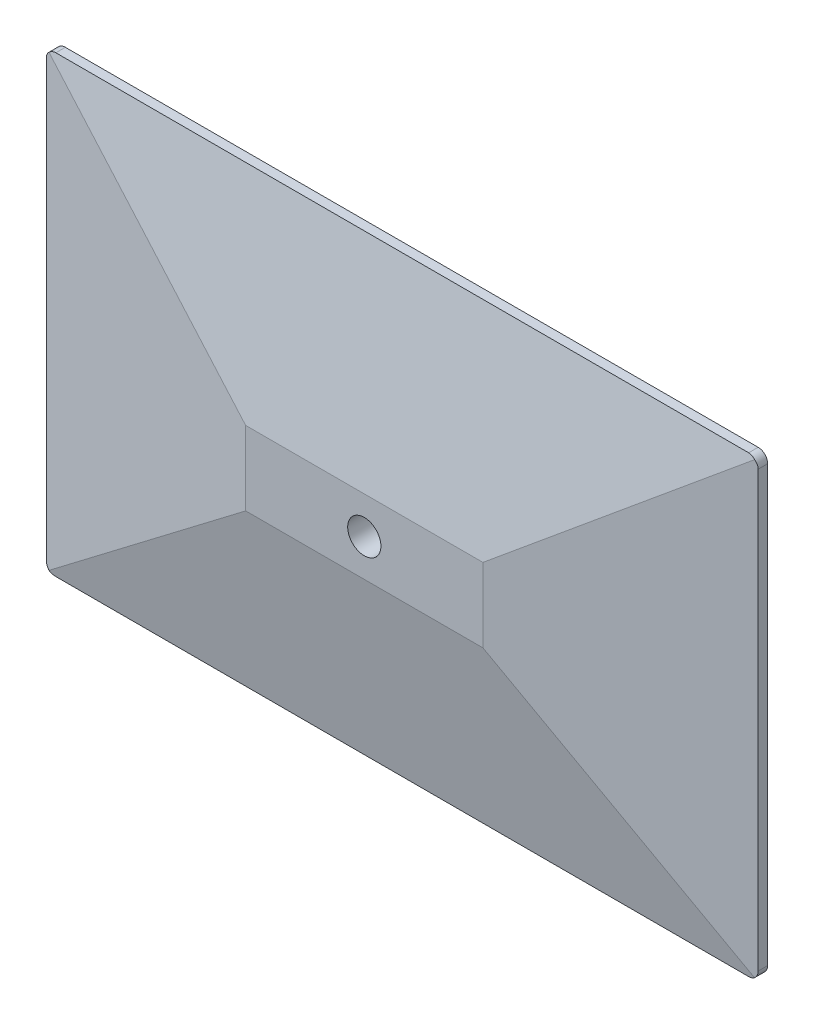
ISO-10303-21;
HEADER;
FILE_DESCRIPTION(('STEP AP214'),'2;1');
FILE_NAME('part.step','',(''),(''),'','','');
FILE_SCHEMA(('AUTOMOTIVE_DESIGN { 1 0 10303 214 1 1 1 1 }'));
ENDSEC;
DATA;
#1=APPLICATION_CONTEXT('core data for automotive mechanical design processes');
#2=APPLICATION_PROTOCOL_DEFINITION('international standard','automotive_design',2000,#1);
#3=PRODUCT_CONTEXT('',#1,'mechanical');
#4=PRODUCT('Part','Part','',(#3));
#5=PRODUCT_RELATED_PRODUCT_CATEGORY('part','',(#4));
#6=PRODUCT_DEFINITION_FORMATION('','',#4);
#7=PRODUCT_DEFINITION_CONTEXT('part definition',#1,'design');
#8=PRODUCT_DEFINITION('design','',#6,#7);
#9=PRODUCT_DEFINITION_SHAPE('','',#8);
#10=(LENGTH_UNIT() NAMED_UNIT(*) SI_UNIT(.MILLI.,.METRE.));
#11=(NAMED_UNIT(*) PLANE_ANGLE_UNIT() SI_UNIT($,.RADIAN.));
#12=(NAMED_UNIT(*) SI_UNIT($,.STERADIAN.) SOLID_ANGLE_UNIT());
#13=UNCERTAINTY_MEASURE_WITH_UNIT(LENGTH_MEASURE(1.E-05),#10,'distance_accuracy_value','');
#14=(GEOMETRIC_REPRESENTATION_CONTEXT(3) GLOBAL_UNCERTAINTY_ASSIGNED_CONTEXT((#13)) GLOBAL_UNIT_ASSIGNED_CONTEXT((#10,
#11,#12)) REPRESENTATION_CONTEXT('',''));
#15=CARTESIAN_POINT('',(0.,0.,0.));
#16=DIRECTION('',(0.,0.,1.));
#17=DIRECTION('',(1.,0.,0.));
#18=AXIS2_PLACEMENT_3D('',#15,#16,#17);
#19=CARTESIAN_POINT('',(0.,0.,2.));
#20=DIRECTION('',(0.,0.,1.));
#21=DIRECTION('',(1.,0.,0.));
#22=AXIS2_PLACEMENT_3D('',#19,#20,#21);
#23=PLANE('',#22);
#24=CARTESIAN_POINT('',(0.,0.,2.));
#25=DIRECTION('',(0.,0.,1.));
#26=DIRECTION('',(1.,0.,0.));
#27=AXIS2_PLACEMENT_3D('',#24,#25,#26);
#28=CIRCLE('',#27,3.5);
#29=CARTESIAN_POINT('',(3.5,0.,2.));
#30=VERTEX_POINT('',#29);
#31=EDGE_CURVE('E19',#30,#30,#28,.T.);
#32=ORIENTED_EDGE('',*,*,#31,.T.);
#33=EDGE_LOOP('',(#32));
#34=FACE_BOUND('',#33,.T.);
#35=ADVANCED_FACE('F16',(#34),#23,.T.);
#36=CARTESIAN_POINT('',(0.,0.,2.));
#37=DIRECTION('',(0.,0.,1.));
#38=DIRECTION('',(1.,0.,0.));
#39=AXIS2_PLACEMENT_3D('',#36,#37,#38);
#40=CYLINDRICAL_SURFACE('',#39,3.5);
#41=CARTESIAN_POINT('',(0.,0.,10.));
#42=DIRECTION('',(0.,0.,1.));
#43=DIRECTION('',(1.,0.,0.));
#44=AXIS2_PLACEMENT_3D('',#41,#42,#43);
#45=CIRCLE('',#44,3.5);
#46=CARTESIAN_POINT('',(3.5,0.,10.));
#47=VERTEX_POINT('',#46);
#48=EDGE_CURVE('E105',#47,#47,#45,.F.);
#49=ORIENTED_EDGE('',*,*,#48,.F.);
#50=EDGE_LOOP('',(#49));
#51=FACE_BOUND('',#50,.T.);
#52=ORIENTED_EDGE('',*,*,#31,.F.);
#53=EDGE_LOOP('',(#52));
#54=FACE_BOUND('',#53,.T.);
#55=ADVANCED_FACE('F148',(#51,#54),#40,.F.);
#56=CARTESIAN_POINT('',(0.,0.,10.));
#57=DIRECTION('',(0.,0.,1.));
#58=DIRECTION('',(1.,0.,0.));
#59=AXIS2_PLACEMENT_3D('',#56,#57,#58);
#60=PLANE('',#59);
#61=DIRECTION('',(1.,0.,0.));
#62=VECTOR('',#61,1.);
#63=CARTESIAN_POINT('',(0.,-7.7999999999993,10.));
#64=LINE('',#63,#62);
#65=CARTESIAN_POINT('',(24.9999999999988,-7.7999999999993,10.));
#66=VERTEX_POINT('',#65);
#67=CARTESIAN_POINT('',(-24.9999999999989,-7.7999999999993,10.));
#68=VERTEX_POINT('',#67);
#69=EDGE_CURVE('E137',#66,#68,#64,.F.);
#70=ORIENTED_EDGE('',*,*,#69,.F.);
#71=DIRECTION('',(0.,1.,0.));
#72=VECTOR('',#71,1.);
#73=CARTESIAN_POINT('',(24.9999999999989,0.,10.));
#74=LINE('',#73,#72);
#75=CARTESIAN_POINT('',(24.9999999999989,7.79999999999934,10.));
#76=VERTEX_POINT('',#75);
#77=EDGE_CURVE('E104',#76,#66,#74,.F.);
#78=ORIENTED_EDGE('',*,*,#77,.F.);
#79=DIRECTION('',(1.,0.,0.));
#80=VECTOR('',#79,1.);
#81=CARTESIAN_POINT('',(0.,7.79999999999934,10.));
#82=LINE('',#81,#80);
#83=CARTESIAN_POINT('',(-24.9999999999989,7.79999999999934,10.));
#84=VERTEX_POINT('',#83);
#85=EDGE_CURVE('E115',#84,#76,#82,.T.);
#86=ORIENTED_EDGE('',*,*,#85,.F.);
#87=DIRECTION('',(0.,1.,0.));
#88=VECTOR('',#87,1.);
#89=CARTESIAN_POINT('',(-24.9999999999989,0.,10.));
#90=LINE('',#89,#88);
#91=EDGE_CURVE('E140',#68,#84,#90,.T.);
#92=ORIENTED_EDGE('',*,*,#91,.F.);
#93=EDGE_LOOP('',(#70,#78,#86,#92));
#94=FACE_BOUND('',#93,.T.);
#95=ORIENTED_EDGE('',*,*,#48,.T.);
#96=EDGE_LOOP('',(#95));
#97=FACE_BOUND('',#96,.T.);
#98=ADVANCED_FACE('F150',(#94,#97),#60,.T.);
#99=CARTESIAN_POINT('',(24.9999999999988,0.,10.));
#100=DIRECTION('',(0.15799050110667,0.,0.987440631916706));
#101=DIRECTION('',(0.987440631916706,0.,-0.15799050110667));
#102=AXIS2_PLACEMENT_3D('',#99,#100,#101);
#103=PLANE('',#102);
#104=DIRECTION('',(0.774844659217182,0.619875727373742,-0.123975145474746));
#105=VECTOR('',#104,1.);
#106=CARTESIAN_POINT('',(24.9999999999989,7.79999999999934,10.));
#107=LINE('',#106,#105);
#108=CARTESIAN_POINT('',(74.3474525171553,47.2779620137243,2.10440759725514));
#109=VERTEX_POINT('',#108);
#110=EDGE_CURVE('E100',#76,#109,#107,.T.);
#111=ORIENTED_EDGE('',*,*,#110,.F.);
#112=ORIENTED_EDGE('',*,*,#77,.T.);
#113=DIRECTION('',(-0.774844659217182,0.619875727373742,0.123975145474746));
#114=VECTOR('',#113,1.);
#115=CARTESIAN_POINT('',(74.3474525171553,-47.2779620137242,2.10440759725514));
#116=LINE('',#115,#114);
#117=CARTESIAN_POINT('',(74.3474525171553,-47.2779620137242,2.10440759725514));
#118=VERTEX_POINT('',#117);
#119=EDGE_CURVE('E336',#118,#66,#116,.T.);
#120=ORIENTED_EDGE('',*,*,#119,.F.);
#121=CARTESIAN_POINT('',(73.,-45.8,2.31999999999999));
#122=DIRECTION('',(0.15799050110667,0.,0.987440631916706));
#123=DIRECTION('',(0.987440631916706,0.,-0.15799050110667));
#124=AXIS2_PLACEMENT_3D('',#121,#122,#123);
#125=ELLIPSE('',#124,2.02543822418755,2.);
#126=CARTESIAN_POINT('',(75.,-45.8,1.99999999999999));
#127=VERTEX_POINT('',#126);
#128=EDGE_CURVE('E131',#127,#118,#125,.F.);
#129=ORIENTED_EDGE('',*,*,#128,.F.);
#130=DIRECTION('',(0.,-1.,0.));
#131=VECTOR('',#130,1.);
#132=CARTESIAN_POINT('',(75.,47.8,1.99999999999999));
#133=LINE('',#132,#131);
#134=CARTESIAN_POINT('',(75.,45.8,1.99999999999999));
#135=VERTEX_POINT('',#134);
#136=EDGE_CURVE('E102',#127,#135,#133,.F.);
#137=ORIENTED_EDGE('',*,*,#136,.T.);
#138=CARTESIAN_POINT('',(73.,45.8,2.31999999999999));
#139=DIRECTION('',(0.15799050110667,0.,0.987440631916706));
#140=DIRECTION('',(0.987440631916706,0.,-0.15799050110667));
#141=AXIS2_PLACEMENT_3D('',#138,#139,#140);
#142=ELLIPSE('',#141,2.02543822418755,2.);
#143=EDGE_CURVE('E92',#135,#109,#142,.T.);
#144=ORIENTED_EDGE('',*,*,#143,.T.);
#145=EDGE_LOOP('',(#111,#112,#120,#129,#137,#144));
#146=FACE_BOUND('',#145,.T.);
#147=ADVANCED_FACE('F97',(#146),#103,.T.);
#148=CARTESIAN_POINT('',(0.,7.79999999999934,10.));
#149=DIRECTION('',(0.,0.196116135138181,0.980580675690921));
#150=DIRECTION('',(0.,-0.980580675690921,0.196116135138181));
#151=AXIS2_PLACEMENT_3D('',#148,#149,#150);
#152=PLANE('',#151);
#153=DIRECTION('',(-0.774844659217182,0.619875727373742,-0.123975145474746));
#154=VECTOR('',#153,1.);
#155=CARTESIAN_POINT('',(-24.9999999999989,7.79999999999934,10.));
#156=LINE('',#155,#154);
#157=CARTESIAN_POINT('',(-74.3474525171553,47.2779620137243,2.10440759725514));
#158=VERTEX_POINT('',#157);
#159=EDGE_CURVE('E313',#84,#158,#156,.T.);
#160=ORIENTED_EDGE('',*,*,#159,.F.);
#161=ORIENTED_EDGE('',*,*,#85,.T.);
#162=ORIENTED_EDGE('',*,*,#110,.T.);
#163=CARTESIAN_POINT('',(73.,45.8,2.39999999999999));
#164=DIRECTION('',(0.,0.196116135138181,0.980580675690921));
#165=DIRECTION('',(0.,0.980580675690921,-0.196116135138181));
#166=AXIS2_PLACEMENT_3D('',#163,#164,#165);
#167=ELLIPSE('',#166,2.03960780543711,2.);
#168=CARTESIAN_POINT('',(73.,47.8,1.99999999999999));
#169=VERTEX_POINT('',#168);
#170=EDGE_CURVE('E112',#169,#109,#167,.F.);
#171=ORIENTED_EDGE('',*,*,#170,.F.);
#172=DIRECTION('',(1.,0.,0.));
#173=VECTOR('',#172,1.);
#174=CARTESIAN_POINT('',(-75.,47.8,1.99999999999999));
#175=LINE('',#174,#173);
#176=CARTESIAN_POINT('',(-73.,47.8,1.99999999999999));
#177=VERTEX_POINT('',#176);
#178=EDGE_CURVE('E124',#169,#177,#175,.F.);
#179=ORIENTED_EDGE('',*,*,#178,.T.);
#180=CARTESIAN_POINT('',(-73.,45.8,2.39999999999999));
#181=DIRECTION('',(0.,0.196116135138181,0.980580675690921));
#182=DIRECTION('',(0.,0.980580675690921,-0.196116135138181));
#183=AXIS2_PLACEMENT_3D('',#180,#181,#182);
#184=ELLIPSE('',#183,2.03960780543711,2.);
#185=EDGE_CURVE('E116',#177,#158,#184,.T.);
#186=ORIENTED_EDGE('',*,*,#185,.T.);
#187=EDGE_LOOP('',(#160,#161,#162,#171,#179,#186));
#188=FACE_BOUND('',#187,.T.);
#189=ADVANCED_FACE('F110',(#188),#152,.T.);
#190=CARTESIAN_POINT('',(-24.9999999999989,0.,10.));
#191=DIRECTION('',(-0.15799050110667,0.,0.987440631916706));
#192=DIRECTION('',(0.987440631916706,0.,0.15799050110667));
#193=AXIS2_PLACEMENT_3D('',#190,#191,#192);
#194=PLANE('',#193);
#195=ORIENTED_EDGE('',*,*,#159,.T.);
#196=CARTESIAN_POINT('',(-73.,45.8,2.31999999999999));
#197=DIRECTION('',(-0.15799050110667,0.,0.987440631916706));
#198=DIRECTION('',(-0.987440631916706,0.,-0.15799050110667));
#199=AXIS2_PLACEMENT_3D('',#196,#197,#198);
#200=ELLIPSE('',#199,2.02543822418755,2.);
#201=CARTESIAN_POINT('',(-75.,45.8,1.99999999999999));
#202=VERTEX_POINT('',#201);
#203=EDGE_CURVE('E129',#202,#158,#200,.F.);
#204=ORIENTED_EDGE('',*,*,#203,.F.);
#205=DIRECTION('',(0.,1.,0.));
#206=VECTOR('',#205,1.);
#207=CARTESIAN_POINT('',(-75.,47.8,1.99999999999999));
#208=LINE('',#207,#206);
#209=CARTESIAN_POINT('',(-75.,-45.8,1.99999999999999));
#210=VERTEX_POINT('',#209);
#211=EDGE_CURVE('E326',#202,#210,#208,.F.);
#212=ORIENTED_EDGE('',*,*,#211,.T.);
#213=CARTESIAN_POINT('',(-73.,-45.8,2.31999999999999));
#214=DIRECTION('',(-0.15799050110667,0.,0.987440631916706));
#215=DIRECTION('',(-0.987440631916706,0.,-0.15799050110667));
#216=AXIS2_PLACEMENT_3D('',#213,#214,#215);
#217=ELLIPSE('',#216,2.02543822418755,2.);
#218=CARTESIAN_POINT('',(-74.3474525171553,-47.2779620137242,2.10440759725514));
#219=VERTEX_POINT('',#218);
#220=EDGE_CURVE('E138',#210,#219,#217,.T.);
#221=ORIENTED_EDGE('',*,*,#220,.T.);
#222=DIRECTION('',(-0.774844659217181,-0.619875727373742,-0.123975145474746));
#223=VECTOR('',#222,1.);
#224=CARTESIAN_POINT('',(-24.9999999999989,-7.7999999999993,10.));
#225=LINE('',#224,#223);
#226=EDGE_CURVE('E320',#68,#219,#225,.T.);
#227=ORIENTED_EDGE('',*,*,#226,.F.);
#228=ORIENTED_EDGE('',*,*,#91,.T.);
#229=EDGE_LOOP('',(#195,#204,#212,#221,#227,#228));
#230=FACE_BOUND('',#229,.T.);
#231=ADVANCED_FACE('F199',(#230),#194,.T.);
#232=CARTESIAN_POINT('',(0.,-7.7999999999993,10.));
#233=DIRECTION('',(0.,-0.196116135138181,0.980580675690921));
#234=DIRECTION('',(0.,-0.980580675690921,-0.196116135138181));
#235=AXIS2_PLACEMENT_3D('',#232,#233,#234);
#236=PLANE('',#235);
#237=ORIENTED_EDGE('',*,*,#119,.T.);
#238=ORIENTED_EDGE('',*,*,#69,.T.);
#239=ORIENTED_EDGE('',*,*,#226,.T.);
#240=CARTESIAN_POINT('',(-73.,-45.8,2.39999999999999));
#241=DIRECTION('',(0.,-0.196116135138181,0.980580675690921));
#242=DIRECTION('',(0.,-0.980580675690921,-0.196116135138181));
#243=AXIS2_PLACEMENT_3D('',#240,#241,#242);
#244=ELLIPSE('',#243,2.03960780543711,2.);
#245=CARTESIAN_POINT('',(-73.,-47.8,1.99999999999999));
#246=VERTEX_POINT('',#245);
#247=EDGE_CURVE('E379',#246,#219,#244,.F.);
#248=ORIENTED_EDGE('',*,*,#247,.F.);
#249=DIRECTION('',(1.,0.,0.));
#250=VECTOR('',#249,1.);
#251=CARTESIAN_POINT('',(-75.,-47.8,1.99999999999999));
#252=LINE('',#251,#250);
#253=CARTESIAN_POINT('',(73.,-47.8,1.99999999999999));
#254=VERTEX_POINT('',#253);
#255=EDGE_CURVE('E345',#246,#254,#252,.T.);
#256=ORIENTED_EDGE('',*,*,#255,.T.);
#257=CARTESIAN_POINT('',(73.,-45.8,2.39999999999999));
#258=DIRECTION('',(0.,-0.196116135138181,0.980580675690921));
#259=DIRECTION('',(0.,-0.980580675690921,-0.196116135138181));
#260=AXIS2_PLACEMENT_3D('',#257,#258,#259);
#261=ELLIPSE('',#260,2.03960780543711,2.);
#262=EDGE_CURVE('E135',#118,#254,#261,.F.);
#263=ORIENTED_EDGE('',*,*,#262,.F.);
#264=EDGE_LOOP('',(#237,#238,#239,#248,#256,#263));
#265=FACE_BOUND('',#264,.T.);
#266=ADVANCED_FACE('F195',(#265),#236,.T.);
#267=CARTESIAN_POINT('',(73.,-45.8,10.));
#268=DIRECTION('',(0.,0.,-1.));
#269=DIRECTION('',(-1.,0.,0.));
#270=AXIS2_PLACEMENT_3D('',#267,#268,#269);
#271=CYLINDRICAL_SURFACE('',#270,2.);
#272=DIRECTION('',(0.,0.,1.));
#273=VECTOR('',#272,1.);
#274=CARTESIAN_POINT('',(75.,-45.7999999999999,10.));
#275=LINE('',#274,#273);
#276=CARTESIAN_POINT('',(75.,-45.8,0.));
#277=VERTEX_POINT('',#276);
#278=EDGE_CURVE('E134',#277,#127,#275,.T.);
#279=ORIENTED_EDGE('',*,*,#278,.T.);
#280=ORIENTED_EDGE('',*,*,#128,.T.);
#281=ORIENTED_EDGE('',*,*,#262,.T.);
#282=DIRECTION('',(0.,0.,1.));
#283=VECTOR('',#282,1.);
#284=CARTESIAN_POINT('',(73.,-47.8,10.));
#285=LINE('',#284,#283);
#286=CARTESIAN_POINT('',(73.,-47.8,0.));
#287=VERTEX_POINT('',#286);
#288=EDGE_CURVE('E381',#254,#287,#285,.F.);
#289=ORIENTED_EDGE('',*,*,#288,.T.);
#290=CARTESIAN_POINT('',(73.,-45.8,0.));
#291=DIRECTION('',(0.,0.,-1.));
#292=DIRECTION('',(-1.,0.,0.));
#293=AXIS2_PLACEMENT_3D('',#290,#291,#292);
#294=CIRCLE('',#293,2.);
#295=EDGE_CURVE('E348',#287,#277,#294,.F.);
#296=ORIENTED_EDGE('',*,*,#295,.T.);
#297=EDGE_LOOP('',(#279,#280,#281,#289,#296));
#298=FACE_BOUND('',#297,.T.);
#299=ADVANCED_FACE('F191',(#298),#271,.T.);
#300=CARTESIAN_POINT('',(75.,47.8,10.));
#301=DIRECTION('',(-1.,0.,0.));
#302=DIRECTION('',(0.,-1.,0.));
#303=AXIS2_PLACEMENT_3D('',#300,#301,#302);
#304=PLANE('',#303);
#305=ORIENTED_EDGE('',*,*,#278,.F.);
#306=DIRECTION('',(0.,1.,0.));
#307=VECTOR('',#306,1.);
#308=CARTESIAN_POINT('',(75.,0.,0.));
#309=LINE('',#308,#307);
#310=CARTESIAN_POINT('',(75.,45.8,0.));
#311=VERTEX_POINT('',#310);
#312=EDGE_CURVE('E377',#277,#311,#309,.T.);
#313=ORIENTED_EDGE('',*,*,#312,.T.);
#314=DIRECTION('',(0.,0.,-1.));
#315=VECTOR('',#314,1.);
#316=CARTESIAN_POINT('',(75.,45.8,10.));
#317=LINE('',#316,#315);
#318=EDGE_CURVE('E122',#135,#311,#317,.T.);
#319=ORIENTED_EDGE('',*,*,#318,.F.);
#320=ORIENTED_EDGE('',*,*,#136,.F.);
#321=EDGE_LOOP('',(#305,#313,#319,#320));
#322=FACE_BOUND('',#321,.T.);
#323=ADVANCED_FACE('F188',(#322),#304,.F.);
#324=CARTESIAN_POINT('',(73.,45.8,10.));
#325=DIRECTION('',(0.,0.,-1.));
#326=DIRECTION('',(-1.,0.,0.));
#327=AXIS2_PLACEMENT_3D('',#324,#325,#326);
#328=CYLINDRICAL_SURFACE('',#327,2.);
#329=DIRECTION('',(0.,0.,-1.));
#330=VECTOR('',#329,1.);
#331=CARTESIAN_POINT('',(73.,47.8,10.));
#332=LINE('',#331,#330);
#333=CARTESIAN_POINT('',(73.,47.8,0.));
#334=VERTEX_POINT('',#333);
#335=EDGE_CURVE('E121',#334,#169,#332,.F.);
#336=ORIENTED_EDGE('',*,*,#335,.T.);
#337=ORIENTED_EDGE('',*,*,#170,.T.);
#338=ORIENTED_EDGE('',*,*,#143,.F.);
#339=ORIENTED_EDGE('',*,*,#318,.T.);
#340=CARTESIAN_POINT('',(73.,45.8,0.));
#341=DIRECTION('',(0.,0.,-1.));
#342=DIRECTION('',(-1.,0.,0.));
#343=AXIS2_PLACEMENT_3D('',#340,#341,#342);
#344=CIRCLE('',#343,2.);
#345=EDGE_CURVE('E375',#311,#334,#344,.F.);
#346=ORIENTED_EDGE('',*,*,#345,.T.);
#347=EDGE_LOOP('',(#336,#337,#338,#339,#346));
#348=FACE_BOUND('',#347,.T.);
#349=ADVANCED_FACE('F119',(#348),#328,.T.);
#350=CARTESIAN_POINT('',(-75.,47.8,10.));
#351=DIRECTION('',(0.,-1.,0.));
#352=DIRECTION('',(0.,0.,-1.));
#353=AXIS2_PLACEMENT_3D('',#350,#351,#352);
#354=PLANE('',#353);
#355=ORIENTED_EDGE('',*,*,#335,.F.);
#356=DIRECTION('',(1.,0.,0.));
#357=VECTOR('',#356,1.);
#358=CARTESIAN_POINT('',(0.,47.8,0.));
#359=LINE('',#358,#357);
#360=CARTESIAN_POINT('',(-73.,47.8,0.));
#361=VERTEX_POINT('',#360);
#362=EDGE_CURVE('E374',#334,#361,#359,.F.);
#363=ORIENTED_EDGE('',*,*,#362,.T.);
#364=DIRECTION('',(0.,0.,-1.));
#365=VECTOR('',#364,1.);
#366=CARTESIAN_POINT('',(-73.,47.8,10.));
#367=LINE('',#366,#365);
#368=EDGE_CURVE('E325',#177,#361,#367,.T.);
#369=ORIENTED_EDGE('',*,*,#368,.F.);
#370=ORIENTED_EDGE('',*,*,#178,.F.);
#371=EDGE_LOOP('',(#355,#363,#369,#370));
#372=FACE_BOUND('',#371,.T.);
#373=ADVANCED_FACE('F181',(#372),#354,.F.);
#374=CARTESIAN_POINT('',(-73.,45.8,10.));
#375=DIRECTION('',(0.,0.,-1.));
#376=DIRECTION('',(-1.,0.,0.));
#377=AXIS2_PLACEMENT_3D('',#374,#375,#376);
#378=CYLINDRICAL_SURFACE('',#377,2.);
#379=DIRECTION('',(0.,0.,1.));
#380=VECTOR('',#379,1.);
#381=CARTESIAN_POINT('',(-75.,45.8,10.));
#382=LINE('',#381,#380);
#383=CARTESIAN_POINT('',(-75.,45.8,0.));
#384=VERTEX_POINT('',#383);
#385=EDGE_CURVE('E324',#384,#202,#382,.T.);
#386=ORIENTED_EDGE('',*,*,#385,.T.);
#387=ORIENTED_EDGE('',*,*,#203,.T.);
#388=ORIENTED_EDGE('',*,*,#185,.F.);
#389=ORIENTED_EDGE('',*,*,#368,.T.);
#390=CARTESIAN_POINT('',(-73.,45.8,0.));
#391=DIRECTION('',(0.,0.,-1.));
#392=DIRECTION('',(-1.,0.,0.));
#393=AXIS2_PLACEMENT_3D('',#390,#391,#392);
#394=CIRCLE('',#393,2.);
#395=EDGE_CURVE('E372',#361,#384,#394,.F.);
#396=ORIENTED_EDGE('',*,*,#395,.T.);
#397=EDGE_LOOP('',(#386,#387,#388,#389,#396));
#398=FACE_BOUND('',#397,.T.);
#399=ADVANCED_FACE('F177',(#398),#378,.T.);
#400=CARTESIAN_POINT('',(-75.,47.8,10.));
#401=DIRECTION('',(1.,0.,0.));
#402=DIRECTION('',(0.,1.,0.));
#403=AXIS2_PLACEMENT_3D('',#400,#401,#402);
#404=PLANE('',#403);
#405=DIRECTION('',(0.,0.,-1.));
#406=VECTOR('',#405,1.);
#407=CARTESIAN_POINT('',(-75.,-45.8,10.));
#408=LINE('',#407,#406);
#409=CARTESIAN_POINT('',(-75.,-45.8,0.));
#410=VERTEX_POINT('',#409);
#411=EDGE_CURVE('E349',#210,#410,#408,.T.);
#412=ORIENTED_EDGE('',*,*,#411,.F.);
#413=ORIENTED_EDGE('',*,*,#211,.F.);
#414=ORIENTED_EDGE('',*,*,#385,.F.);
#415=DIRECTION('',(0.,1.,0.));
#416=VECTOR('',#415,1.);
#417=CARTESIAN_POINT('',(-75.,0.,0.));
#418=LINE('',#417,#416);
#419=EDGE_CURVE('E371',#384,#410,#418,.F.);
#420=ORIENTED_EDGE('',*,*,#419,.T.);
#421=EDGE_LOOP('',(#412,#413,#414,#420));
#422=FACE_BOUND('',#421,.T.);
#423=ADVANCED_FACE('F173',(#422),#404,.F.);
#424=CARTESIAN_POINT('',(-73.,-45.8,10.));
#425=DIRECTION('',(0.,0.,-1.));
#426=DIRECTION('',(-1.,0.,0.));
#427=AXIS2_PLACEMENT_3D('',#424,#425,#426);
#428=CYLINDRICAL_SURFACE('',#427,2.);
#429=DIRECTION('',(0.,0.,1.));
#430=VECTOR('',#429,1.);
#431=CARTESIAN_POINT('',(-73.,-47.8,10.));
#432=LINE('',#431,#430);
#433=CARTESIAN_POINT('',(-73.,-47.8,0.));
#434=VERTEX_POINT('',#433);
#435=EDGE_CURVE('E33',#434,#246,#432,.T.);
#436=ORIENTED_EDGE('',*,*,#435,.T.);
#437=ORIENTED_EDGE('',*,*,#247,.T.);
#438=ORIENTED_EDGE('',*,*,#220,.F.);
#439=ORIENTED_EDGE('',*,*,#411,.T.);
#440=CARTESIAN_POINT('',(-73.,-45.8,0.));
#441=DIRECTION('',(0.,0.,-1.));
#442=DIRECTION('',(-1.,0.,0.));
#443=AXIS2_PLACEMENT_3D('',#440,#441,#442);
#444=CIRCLE('',#443,2.);
#445=EDGE_CURVE('E25',#410,#434,#444,.F.);
#446=ORIENTED_EDGE('',*,*,#445,.T.);
#447=EDGE_LOOP('',(#436,#437,#438,#439,#446));
#448=FACE_BOUND('',#447,.T.);
#449=ADVANCED_FACE('F167',(#448),#428,.T.);
#450=CARTESIAN_POINT('',(-75.,-47.8,10.));
#451=DIRECTION('',(0.,1.,0.));
#452=DIRECTION('',(0.,0.,1.));
#453=AXIS2_PLACEMENT_3D('',#450,#451,#452);
#454=PLANE('',#453);
#455=ORIENTED_EDGE('',*,*,#435,.F.);
#456=DIRECTION('',(1.,0.,0.));
#457=VECTOR('',#456,1.);
#458=CARTESIAN_POINT('',(0.,-47.8,0.));
#459=LINE('',#458,#457);
#460=EDGE_CURVE('E11',#434,#287,#459,.T.);
#461=ORIENTED_EDGE('',*,*,#460,.T.);
#462=ORIENTED_EDGE('',*,*,#288,.F.);
#463=ORIENTED_EDGE('',*,*,#255,.F.);
#464=EDGE_LOOP('',(#455,#461,#462,#463));
#465=FACE_BOUND('',#464,.T.);
#466=ADVANCED_FACE('F161',(#465),#454,.F.);
#467=CARTESIAN_POINT('',(0.,0.,0.));
#468=DIRECTION('',(0.,0.,1.));
#469=DIRECTION('',(1.,0.,0.));
#470=AXIS2_PLACEMENT_3D('',#467,#468,#469);
#471=PLANE('',#470);
#472=ORIENTED_EDGE('',*,*,#445,.F.);
#473=ORIENTED_EDGE('',*,*,#419,.F.);
#474=ORIENTED_EDGE('',*,*,#395,.F.);
#475=ORIENTED_EDGE('',*,*,#362,.F.);
#476=ORIENTED_EDGE('',*,*,#345,.F.);
#477=ORIENTED_EDGE('',*,*,#312,.F.);
#478=ORIENTED_EDGE('',*,*,#295,.F.);
#479=ORIENTED_EDGE('',*,*,#460,.F.);
#480=EDGE_LOOP('',(#472,#473,#474,#475,#476,#477,#478,#479));
#481=FACE_BOUND('',#480,.T.);
#482=ADVANCED_FACE('F159',(#481),#471,.F.);
#483=CLOSED_SHELL('',(#35,#55,#98,#147,#189,#231,#266,#299,#323,#349,#373,#399,#423,#449,#466,#482));
#484=MANIFOLD_SOLID_BREP('B1',#483);
#485=ADVANCED_BREP_SHAPE_REPRESENTATION('',(#18,#484),#14);
#486=SHAPE_DEFINITION_REPRESENTATION(#9,#485);
ENDSEC;
END-ISO-10303-21;
